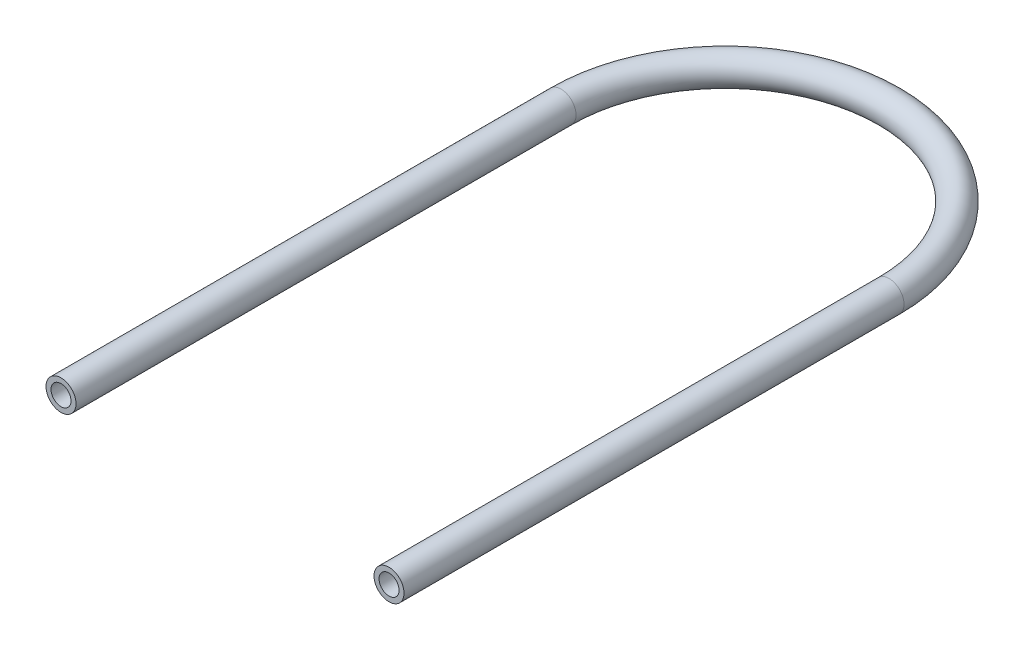
ISO-10303-21;
HEADER;
FILE_DESCRIPTION(('STEP AP214'),'2;1');
FILE_NAME('part.step','',(''),(''),'','','');
FILE_SCHEMA(('AUTOMOTIVE_DESIGN { 1 0 10303 214 1 1 1 1 }'));
ENDSEC;
DATA;
#1=APPLICATION_CONTEXT('core data for automotive mechanical design processes');
#2=APPLICATION_PROTOCOL_DEFINITION('international standard','automotive_design',2000,#1);
#3=PRODUCT_CONTEXT('',#1,'mechanical');
#4=PRODUCT('Part','Part','',(#3));
#5=PRODUCT_RELATED_PRODUCT_CATEGORY('part','',(#4));
#6=PRODUCT_DEFINITION_FORMATION('','',#4);
#7=PRODUCT_DEFINITION_CONTEXT('part definition',#1,'design');
#8=PRODUCT_DEFINITION('design','',#6,#7);
#9=PRODUCT_DEFINITION_SHAPE('','',#8);
#10=(LENGTH_UNIT() NAMED_UNIT(*) SI_UNIT(.MILLI.,.METRE.));
#11=(NAMED_UNIT(*) PLANE_ANGLE_UNIT() SI_UNIT($,.RADIAN.));
#12=(NAMED_UNIT(*) SI_UNIT($,.STERADIAN.) SOLID_ANGLE_UNIT());
#13=UNCERTAINTY_MEASURE_WITH_UNIT(LENGTH_MEASURE(1.E-05),#10,'distance_accuracy_value','');
#14=(GEOMETRIC_REPRESENTATION_CONTEXT(3) GLOBAL_UNCERTAINTY_ASSIGNED_CONTEXT((#13)) GLOBAL_UNIT_ASSIGNED_CONTEXT((#10,
#11,#12)) REPRESENTATION_CONTEXT('',''));
#15=CARTESIAN_POINT('',(0.,0.,0.));
#16=DIRECTION('',(0.,0.,1.));
#17=DIRECTION('',(1.,0.,0.));
#18=AXIS2_PLACEMENT_3D('',#15,#16,#17);
#19=CARTESIAN_POINT('',(-41.7882352941177,0.,18.2352941176471));
#20=DIRECTION('',(0.,0.,-1.));
#21=DIRECTION('',(-1.,0.,0.));
#22=AXIS2_PLACEMENT_3D('',#19,#20,#21);
#23=CYLINDRICAL_SURFACE('',#22,1.5);
#24=CARTESIAN_POINT('',(-41.7882352941177,0.,-31.764705882353));
#25=DIRECTION('',(0.,0.,-1.));
#26=DIRECTION('',(-1.,0.,0.));
#27=AXIS2_PLACEMENT_3D('',#24,#25,#26);
#28=CIRCLE('',#27,1.5);
#29=CARTESIAN_POINT('',(-43.2882352941177,0.,-31.764705882353));
#30=VERTEX_POINT('',#29);
#31=EDGE_CURVE('E64',#30,#30,#28,.T.);
#32=ORIENTED_EDGE('',*,*,#31,.F.);
#33=EDGE_LOOP('',(#32));
#34=FACE_BOUND('',#33,.T.);
#35=CARTESIAN_POINT('',(-41.7882352941177,0.,18.2352941176471));
#36=DIRECTION('',(0.,0.,-1.));
#37=DIRECTION('',(-1.,0.,0.));
#38=AXIS2_PLACEMENT_3D('',#35,#36,#37);
#39=CIRCLE('',#38,1.5);
#40=CARTESIAN_POINT('',(-43.2882352941177,0.,18.2352941176471));
#41=VERTEX_POINT('',#40);
#42=EDGE_CURVE('E61',#41,#41,#39,.T.);
#43=ORIENTED_EDGE('',*,*,#42,.T.);
#44=EDGE_LOOP('',(#43));
#45=FACE_BOUND('',#44,.T.);
#46=ADVANCED_FACE('F37',(#34,#45),#23,.T.);
#47=CARTESIAN_POINT('',(-25.3882352941177,0.,-31.764705882353));
#48=DIRECTION('',(0.,-1.,0.));
#49=DIRECTION('',(0.,0.,-1.));
#50=AXIS2_PLACEMENT_3D('',#47,#48,#49);
#51=TOROIDAL_SURFACE('',#50,16.4,1.5);
#52=CARTESIAN_POINT('',(-8.98823529411767,0.,-31.764705882353));
#53=DIRECTION('',(0.,0.,1.));
#54=DIRECTION('',(1.,0.,0.));
#55=AXIS2_PLACEMENT_3D('',#52,#53,#54);
#56=CIRCLE('',#55,1.5);
#57=CARTESIAN_POINT('',(-7.48823529411767,0.,-31.764705882353));
#58=VERTEX_POINT('',#57);
#59=EDGE_CURVE('E41',#58,#58,#56,.T.);
#60=CARTESIAN_POINT('',(-25.3882352941177,0.,-31.764705882353));
#61=DIRECTION('',(0.,-1.,0.));
#62=DIRECTION('',(0.,0.,-1.));
#63=AXIS2_PLACEMENT_3D('',#60,#61,#62);
#64=CIRCLE('',#63,17.9);
#65=EDGE_CURVE('',#30,#58,#64,.T.);
#66=ORIENTED_EDGE('',*,*,#31,.T.);
#67=ORIENTED_EDGE('',*,*,#59,.F.);
#68=ORIENTED_EDGE('',*,*,#65,.T.);
#69=ORIENTED_EDGE('',*,*,#65,.F.);
#70=EDGE_LOOP('',(#66,#68,#67,#69));
#71=FACE_BOUND('',#70,.T.);
#72=ADVANCED_FACE('F74',(#71),#51,.T.);
#73=CARTESIAN_POINT('',(-8.98823529411767,0.,-31.764705882353));
#74=DIRECTION('',(0.,0.,1.));
#75=DIRECTION('',(1.,0.,0.));
#76=AXIS2_PLACEMENT_3D('',#73,#74,#75);
#77=CYLINDRICAL_SURFACE('',#76,1.5);
#78=CARTESIAN_POINT('',(-8.98823529411766,0.,18.2352941176471));
#79=DIRECTION('',(0.,0.,1.));
#80=DIRECTION('',(1.,0.,0.));
#81=AXIS2_PLACEMENT_3D('',#78,#79,#80);
#82=CIRCLE('',#81,1.5);
#83=CARTESIAN_POINT('',(-7.48823529411767,0.,18.2352941176471));
#84=VERTEX_POINT('',#83);
#85=EDGE_CURVE('E56',#84,#84,#82,.T.);
#86=ORIENTED_EDGE('',*,*,#85,.F.);
#87=EDGE_LOOP('',(#86));
#88=FACE_BOUND('',#87,.T.);
#89=ORIENTED_EDGE('',*,*,#59,.T.);
#90=EDGE_LOOP('',(#89));
#91=FACE_BOUND('',#90,.T.);
#92=ADVANCED_FACE('F39',(#88,#91),#77,.T.);
#93=CARTESIAN_POINT('',(-41.7882352941177,0.,18.2352941176471));
#94=DIRECTION('',(0.,0.,-1.));
#95=DIRECTION('',(-1.,0.,0.));
#96=AXIS2_PLACEMENT_3D('',#93,#94,#95);
#97=PLANE('',#96);
#98=CARTESIAN_POINT('',(-41.7882352941177,0.,18.2352941176471));
#99=DIRECTION('',(0.,0.,-1.));
#100=DIRECTION('',(-1.,0.,0.));
#101=AXIS2_PLACEMENT_3D('',#98,#99,#100);
#102=CIRCLE('',#101,0.999999999999998);
#103=CARTESIAN_POINT('',(-42.7882352941177,0.,18.2352941176471));
#104=VERTEX_POINT('',#103);
#105=EDGE_CURVE('E60',#104,#104,#102,.F.);
#106=ORIENTED_EDGE('',*,*,#105,.F.);
#107=EDGE_LOOP('',(#106));
#108=FACE_BOUND('',#107,.T.);
#109=ORIENTED_EDGE('',*,*,#42,.F.);
#110=EDGE_LOOP('',(#109));
#111=FACE_BOUND('',#110,.T.);
#112=ADVANCED_FACE('F80',(#108,#111),#97,.F.);
#113=CARTESIAN_POINT('',(-8.98823529411766,0.,18.2352941176471));
#114=DIRECTION('',(0.,0.,1.));
#115=DIRECTION('',(1.,0.,0.));
#116=AXIS2_PLACEMENT_3D('',#113,#114,#115);
#117=PLANE('',#116);
#118=CARTESIAN_POINT('',(-8.98823529411766,0.,18.2352941176471));
#119=DIRECTION('',(0.,0.,1.));
#120=DIRECTION('',(1.,0.,0.));
#121=AXIS2_PLACEMENT_3D('',#118,#119,#120);
#122=CIRCLE('',#121,0.999999999999998);
#123=CARTESIAN_POINT('',(-7.98823529411767,0.,18.2352941176471));
#124=VERTEX_POINT('',#123);
#125=EDGE_CURVE('E10',#124,#124,#122,.F.);
#126=ORIENTED_EDGE('',*,*,#125,.T.);
#127=EDGE_LOOP('',(#126));
#128=FACE_BOUND('',#127,.T.);
#129=ORIENTED_EDGE('',*,*,#85,.T.);
#130=EDGE_LOOP('',(#129));
#131=FACE_BOUND('',#130,.T.);
#132=ADVANCED_FACE('F98',(#128,#131),#117,.T.);
#133=CARTESIAN_POINT('',(-41.7882352941177,0.,18.2352941176471));
#134=DIRECTION('',(0.,0.,-1.));
#135=DIRECTION('',(-1.,0.,0.));
#136=AXIS2_PLACEMENT_3D('',#133,#134,#135);
#137=CYLINDRICAL_SURFACE('',#136,0.999999999999998);
#138=CARTESIAN_POINT('',(-41.7882352941177,0.,-31.764705882353));
#139=DIRECTION('',(0.,0.,-1.));
#140=DIRECTION('',(-1.,0.,0.));
#141=AXIS2_PLACEMENT_3D('',#138,#139,#140);
#142=CIRCLE('',#141,0.999999999999998);
#143=CARTESIAN_POINT('',(-42.7882352941177,0.,-31.764705882353));
#144=VERTEX_POINT('',#143);
#145=EDGE_CURVE('E52',#144,#144,#142,.F.);
#146=ORIENTED_EDGE('',*,*,#145,.F.);
#147=EDGE_LOOP('',(#146));
#148=FACE_BOUND('',#147,.T.);
#149=ORIENTED_EDGE('',*,*,#105,.T.);
#150=EDGE_LOOP('',(#149));
#151=FACE_BOUND('',#150,.T.);
#152=ADVANCED_FACE('F92',(#148,#151),#137,.F.);
#153=CARTESIAN_POINT('',(-25.3882352941177,0.,-31.764705882353));
#154=DIRECTION('',(0.,-1.,0.));
#155=DIRECTION('',(0.,0.,-1.));
#156=AXIS2_PLACEMENT_3D('',#153,#154,#155);
#157=TOROIDAL_SURFACE('',#156,16.4,0.999999999999998);
#158=CARTESIAN_POINT('',(-8.98823529411767,0.,-31.764705882353));
#159=DIRECTION('',(0.,0.,1.));
#160=DIRECTION('',(1.,0.,0.));
#161=AXIS2_PLACEMENT_3D('',#158,#159,#160);
#162=CIRCLE('',#161,0.999999999999998);
#163=CARTESIAN_POINT('',(-7.98823529411767,0.,-31.764705882353));
#164=VERTEX_POINT('',#163);
#165=EDGE_CURVE('E46',#164,#164,#162,.F.);
#166=CARTESIAN_POINT('',(-25.3882352941177,0.,-31.764705882353));
#167=DIRECTION('',(0.,-1.,0.));
#168=DIRECTION('',(0.,0.,-1.));
#169=AXIS2_PLACEMENT_3D('',#166,#167,#168);
#170=CIRCLE('',#169,17.4);
#171=EDGE_CURVE('',#144,#164,#170,.T.);
#172=ORIENTED_EDGE('',*,*,#145,.T.);
#173=ORIENTED_EDGE('',*,*,#165,.F.);
#174=ORIENTED_EDGE('',*,*,#171,.T.);
#175=ORIENTED_EDGE('',*,*,#171,.F.);
#176=EDGE_LOOP('',(#172,#174,#173,#175));
#177=FACE_BOUND('',#176,.T.);
#178=ADVANCED_FACE('F86',(#177),#157,.F.);
#179=CARTESIAN_POINT('',(-8.98823529411767,0.,-31.764705882353));
#180=DIRECTION('',(0.,0.,1.));
#181=DIRECTION('',(1.,0.,0.));
#182=AXIS2_PLACEMENT_3D('',#179,#180,#181);
#183=CYLINDRICAL_SURFACE('',#182,0.999999999999998);
#184=ORIENTED_EDGE('',*,*,#125,.F.);
#185=EDGE_LOOP('',(#184));
#186=FACE_BOUND('',#185,.T.);
#187=ORIENTED_EDGE('',*,*,#165,.T.);
#188=EDGE_LOOP('',(#187));
#189=FACE_BOUND('',#188,.T.);
#190=ADVANCED_FACE('F84',(#186,#189),#183,.F.);
#191=CLOSED_SHELL('',(#46,#72,#92,#112,#132,#152,#178,#190));
#192=MANIFOLD_SOLID_BREP('B2',#191);
#193=ADVANCED_BREP_SHAPE_REPRESENTATION('',(#18,#192),#14);
#194=SHAPE_DEFINITION_REPRESENTATION(#9,#193);
ENDSEC;
END-ISO-10303-21;
